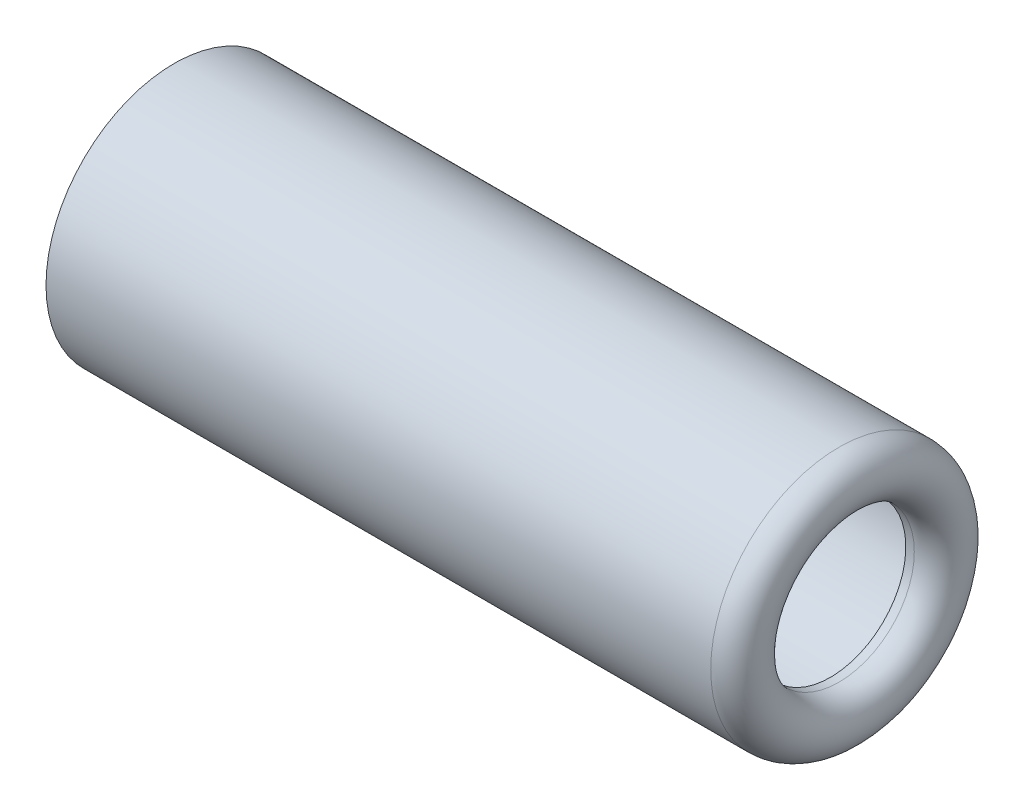
ISO-10303-21;
HEADER;
FILE_DESCRIPTION(('STEP AP214'),'2;1');
FILE_NAME('part.step','',(''),(''),'','','');
FILE_SCHEMA(('AUTOMOTIVE_DESIGN { 1 0 10303 214 1 1 1 1 }'));
ENDSEC;
DATA;
#1=APPLICATION_CONTEXT('core data for automotive mechanical design processes');
#2=APPLICATION_PROTOCOL_DEFINITION('international standard','automotive_design',2000,#1);
#3=PRODUCT_CONTEXT('',#1,'mechanical');
#4=PRODUCT('Part','Part','',(#3));
#5=PRODUCT_RELATED_PRODUCT_CATEGORY('part','',(#4));
#6=PRODUCT_DEFINITION_FORMATION('','',#4);
#7=PRODUCT_DEFINITION_CONTEXT('part definition',#1,'design');
#8=PRODUCT_DEFINITION('design','',#6,#7);
#9=PRODUCT_DEFINITION_SHAPE('','',#8);
#10=(LENGTH_UNIT() NAMED_UNIT(*) SI_UNIT(.MILLI.,.METRE.));
#11=(NAMED_UNIT(*) PLANE_ANGLE_UNIT() SI_UNIT($,.RADIAN.));
#12=(NAMED_UNIT(*) SI_UNIT($,.STERADIAN.) SOLID_ANGLE_UNIT());
#13=UNCERTAINTY_MEASURE_WITH_UNIT(LENGTH_MEASURE(1.E-05),#10,'distance_accuracy_value','');
#14=(GEOMETRIC_REPRESENTATION_CONTEXT(3) GLOBAL_UNCERTAINTY_ASSIGNED_CONTEXT((#13)) GLOBAL_UNIT_ASSIGNED_CONTEXT((#10,
#11,#12)) REPRESENTATION_CONTEXT('',''));
#15=CARTESIAN_POINT('',(0.,0.,0.));
#16=DIRECTION('',(0.,0.,1.));
#17=DIRECTION('',(1.,0.,0.));
#18=AXIS2_PLACEMENT_3D('',#15,#16,#17);
#19=CARTESIAN_POINT('',(39.7603578881729,6.59809706871073E-11,9.42767131723032E-12));
#20=DIRECTION('',(-1.,-2.26740237577486E-12,3.49943557413695E-13));
#21=DIRECTION('',(3.49943557413695E-13,0.,1.));
#22=AXIS2_PLACEMENT_3D('',#19,#20,#21);
#23=TOROIDAL_SURFACE('',#22,2.52095000003156,0.654049999990024);
#24=CARTESIAN_POINT('',(39.76035788817,0.,0.));
#25=DIRECTION('',(-1.,0.,0.));
#26=DIRECTION('',(0.,0.,-1.));
#27=AXIS2_PLACEMENT_3D('',#24,#25,#26);
#28=CIRCLE('',#27,1.8669);
#29=CARTESIAN_POINT('',(39.76035788817,0.,-1.8669));
#30=VERTEX_POINT('',#29);
#31=EDGE_CURVE('E23',#30,#30,#28,.T.);
#32=ORIENTED_EDGE('',*,*,#31,.T.);
#33=EDGE_LOOP('',(#32));
#34=FACE_BOUND('',#33,.T.);
#35=CARTESIAN_POINT('',(39.76035788817,0.,0.));
#36=DIRECTION('',(1.,0.,0.));
#37=DIRECTION('',(0.,0.,1.));
#38=AXIS2_PLACEMENT_3D('',#35,#36,#37);
#39=CIRCLE('',#38,3.175);
#40=CARTESIAN_POINT('',(39.76035788817,0.,3.175));
#41=VERTEX_POINT('',#40);
#42=EDGE_CURVE('E10',#41,#41,#39,.T.);
#43=ORIENTED_EDGE('',*,*,#42,.T.);
#44=EDGE_LOOP('',(#43));
#45=FACE_BOUND('',#44,.T.);
#46=ADVANCED_FACE('F15',(#34,#45),#23,.T.);
#47=CARTESIAN_POINT('',(0.,0.,0.));
#48=DIRECTION('',(-1.,0.,0.));
#49=DIRECTION('',(0.,0.,1.));
#50=AXIS2_PLACEMENT_3D('',#47,#48,#49);
#51=CYLINDRICAL_SURFACE('',#50,3.175);
#52=ORIENTED_EDGE('',*,*,#42,.F.);
#53=EDGE_LOOP('',(#52));
#54=FACE_BOUND('',#53,.T.);
#55=CARTESIAN_POINT('',(23.29480788816,0.,0.));
#56=DIRECTION('',(-1.,0.,0.));
#57=DIRECTION('',(0.,0.,1.));
#58=AXIS2_PLACEMENT_3D('',#55,#56,#57);
#59=CIRCLE('',#58,3.175);
#60=CARTESIAN_POINT('',(23.29480788816,0.,3.175));
#61=VERTEX_POINT('',#60);
#62=EDGE_CURVE('E31',#61,#61,#59,.T.);
#63=ORIENTED_EDGE('',*,*,#62,.F.);
#64=EDGE_LOOP('',(#63));
#65=FACE_BOUND('',#64,.T.);
#66=ADVANCED_FACE('F77',(#54,#65),#51,.T.);
#67=CARTESIAN_POINT('',(0.,0.,0.));
#68=DIRECTION('',(-1.,0.,0.));
#69=DIRECTION('',(0.,0.,1.));
#70=AXIS2_PLACEMENT_3D('',#67,#68,#69);
#71=CYLINDRICAL_SURFACE('',#70,1.8669);
#72=CARTESIAN_POINT('',(39.55080788817,0.,0.));
#73=DIRECTION('',(1.,0.,0.));
#74=DIRECTION('',(0.,0.,1.));
#75=AXIS2_PLACEMENT_3D('',#72,#73,#74);
#76=CIRCLE('',#75,1.8669);
#77=CARTESIAN_POINT('',(39.55080788817,0.,1.8669));
#78=VERTEX_POINT('',#77);
#79=EDGE_CURVE('E35',#78,#78,#76,.T.);
#80=ORIENTED_EDGE('',*,*,#79,.F.);
#81=EDGE_LOOP('',(#80));
#82=FACE_BOUND('',#81,.T.);
#83=ORIENTED_EDGE('',*,*,#31,.F.);
#84=EDGE_LOOP('',(#83));
#85=FACE_BOUND('',#84,.T.);
#86=ADVANCED_FACE('F71',(#82,#85),#71,.F.);
#87=CARTESIAN_POINT('',(39.55080788817,2.0574,0.));
#88=DIRECTION('',(1.,0.,0.));
#89=DIRECTION('',(0.,0.,-1.));
#90=AXIS2_PLACEMENT_3D('',#87,#88,#89);
#91=PLANE('',#90);
#92=CARTESIAN_POINT('',(39.55080788817,0.,0.));
#93=DIRECTION('',(-1.,0.,0.));
#94=DIRECTION('',(0.,0.,-1.));
#95=AXIS2_PLACEMENT_3D('',#92,#93,#94);
#96=CIRCLE('',#95,2.0574);
#97=CARTESIAN_POINT('',(39.55080788817,0.,-2.0574));
#98=VERTEX_POINT('',#97);
#99=EDGE_CURVE('E28',#98,#98,#96,.T.);
#100=ORIENTED_EDGE('',*,*,#99,.T.);
#101=EDGE_LOOP('',(#100));
#102=FACE_BOUND('',#101,.T.);
#103=ORIENTED_EDGE('',*,*,#79,.T.);
#104=EDGE_LOOP('',(#103));
#105=FACE_BOUND('',#104,.T.);
#106=ADVANCED_FACE('F65',(#102,#105),#91,.F.);
#107=CARTESIAN_POINT('',(0.,0.,0.));
#108=DIRECTION('',(-1.,0.,0.));
#109=DIRECTION('',(0.,0.,1.));
#110=AXIS2_PLACEMENT_3D('',#107,#108,#109);
#111=CYLINDRICAL_SURFACE('',#110,2.0574);
#112=CARTESIAN_POINT('',(39.76035788817,0.,0.));
#113=DIRECTION('',(1.,0.,0.));
#114=DIRECTION('',(0.,0.,1.));
#115=AXIS2_PLACEMENT_3D('',#112,#113,#114);
#116=CIRCLE('',#115,2.0574);
#117=CARTESIAN_POINT('',(39.76035788817,0.,2.0574));
#118=VERTEX_POINT('',#117);
#119=EDGE_CURVE('E38',#118,#118,#116,.T.);
#120=ORIENTED_EDGE('',*,*,#119,.F.);
#121=EDGE_LOOP('',(#120));
#122=FACE_BOUND('',#121,.T.);
#123=ORIENTED_EDGE('',*,*,#99,.F.);
#124=EDGE_LOOP('',(#123));
#125=FACE_BOUND('',#124,.T.);
#126=ADVANCED_FACE('F59',(#122,#125),#111,.T.);
#127=CARTESIAN_POINT('',(39.7603578881655,2.05067907099732E-11,3.19033861828633E-12));
#128=DIRECTION('',(-1.,-1.1563132520104E-12,1.38601160767008E-13));
#129=DIRECTION('',(1.38601160767008E-13,0.,1.));
#130=AXIS2_PLACEMENT_3D('',#127,#128,#129);
#131=TOROIDAL_SURFACE('',#130,2.52094999998975,0.46355000000375);
#132=CARTESIAN_POINT('',(39.76035788817,0.,0.));
#133=DIRECTION('',(-1.,0.,0.));
#134=DIRECTION('',(0.,0.,1.));
#135=AXIS2_PLACEMENT_3D('',#132,#133,#134);
#136=CIRCLE('',#135,2.9845);
#137=CARTESIAN_POINT('',(39.76035788817,0.,2.9845));
#138=VERTEX_POINT('',#137);
#139=EDGE_CURVE('E43',#138,#138,#136,.T.);
#140=ORIENTED_EDGE('',*,*,#139,.T.);
#141=EDGE_LOOP('',(#140));
#142=FACE_BOUND('',#141,.T.);
#143=ORIENTED_EDGE('',*,*,#119,.T.);
#144=EDGE_LOOP('',(#143));
#145=FACE_BOUND('',#144,.T.);
#146=ADVANCED_FACE('F53',(#142,#145),#131,.F.);
#147=CARTESIAN_POINT('',(0.,0.,0.));
#148=DIRECTION('',(-1.,0.,0.));
#149=DIRECTION('',(0.,0.,1.));
#150=AXIS2_PLACEMENT_3D('',#147,#148,#149);
#151=CYLINDRICAL_SURFACE('',#150,2.9845);
#152=CARTESIAN_POINT('',(23.42180788816,0.,0.));
#153=DIRECTION('',(1.,0.,0.));
#154=DIRECTION('',(0.,0.,1.));
#155=AXIS2_PLACEMENT_3D('',#152,#153,#154);
#156=CIRCLE('',#155,2.9845);
#157=CARTESIAN_POINT('',(23.42180788816,0.,2.9845));
#158=VERTEX_POINT('',#157);
#159=EDGE_CURVE('E34',#158,#158,#156,.T.);
#160=ORIENTED_EDGE('',*,*,#159,.F.);
#161=EDGE_LOOP('',(#160));
#162=FACE_BOUND('',#161,.T.);
#163=ORIENTED_EDGE('',*,*,#139,.F.);
#164=EDGE_LOOP('',(#163));
#165=FACE_BOUND('',#164,.T.);
#166=ADVANCED_FACE('F50',(#162,#165),#151,.F.);
#167=CARTESIAN_POINT('',(23.42180788816,0.,0.));
#168=DIRECTION('',(-1.,0.,0.));
#169=DIRECTION('',(0.,0.,-1.));
#170=AXIS2_PLACEMENT_3D('',#167,#168,#169);
#171=TOROIDAL_SURFACE('',#170,3.1115,0.127);
#172=CARTESIAN_POINT('',(23.29480788816,0.,0.));
#173=DIRECTION('',(1.,0.,0.));
#174=DIRECTION('',(0.,0.,1.));
#175=AXIS2_PLACEMENT_3D('',#172,#173,#174);
#176=CIRCLE('',#175,3.1115);
#177=CARTESIAN_POINT('',(23.29480788816,0.,3.1115));
#178=VERTEX_POINT('',#177);
#179=EDGE_CURVE('E19',#178,#178,#176,.T.);
#180=ORIENTED_EDGE('',*,*,#179,.F.);
#181=EDGE_LOOP('',(#180));
#182=FACE_BOUND('',#181,.T.);
#183=ORIENTED_EDGE('',*,*,#159,.T.);
#184=EDGE_LOOP('',(#183));
#185=FACE_BOUND('',#184,.T.);
#186=ADVANCED_FACE('F48',(#182,#185),#171,.T.);
#187=CARTESIAN_POINT('',(23.29480788816,3.1115,0.));
#188=DIRECTION('',(1.,0.,0.));
#189=DIRECTION('',(0.,0.,-1.));
#190=AXIS2_PLACEMENT_3D('',#187,#188,#189);
#191=PLANE('',#190);
#192=ORIENTED_EDGE('',*,*,#62,.T.);
#193=EDGE_LOOP('',(#192));
#194=FACE_BOUND('',#193,.T.);
#195=ORIENTED_EDGE('',*,*,#179,.T.);
#196=EDGE_LOOP('',(#195));
#197=FACE_BOUND('',#196,.T.);
#198=ADVANCED_FACE('F17',(#194,#197),#191,.F.);
#199=CLOSED_SHELL('',(#46,#66,#86,#106,#126,#146,#166,#186,#198));
#200=MANIFOLD_SOLID_BREP('B1',#199);
#201=ADVANCED_BREP_SHAPE_REPRESENTATION('',(#18,#200),#14);
#202=SHAPE_DEFINITION_REPRESENTATION(#9,#201);
ENDSEC;
END-ISO-10303-21;
